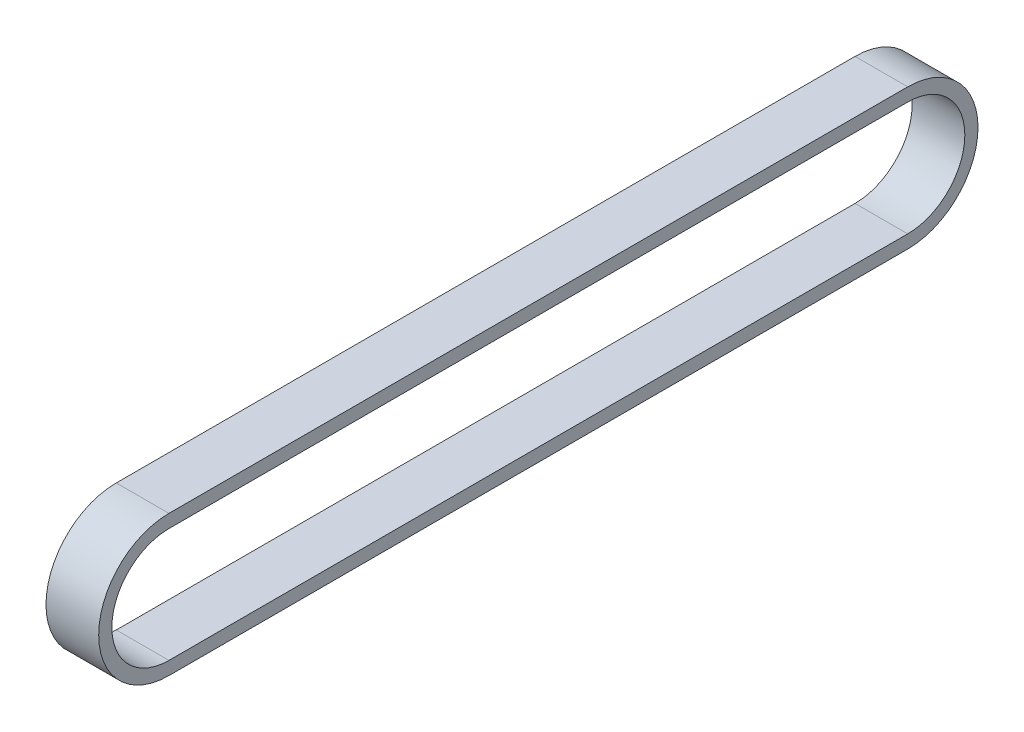
ISO-10303-21;
HEADER;
FILE_DESCRIPTION(('STEP AP214'),'2;1');
FILE_NAME('part.step','',(''),(''),'','','');
FILE_SCHEMA(('AUTOMOTIVE_DESIGN { 1 0 10303 214 1 1 1 1 }'));
ENDSEC;
DATA;
#1=APPLICATION_CONTEXT('core data for automotive mechanical design processes');
#2=APPLICATION_PROTOCOL_DEFINITION('international standard','automotive_design',2000,#1);
#3=PRODUCT_CONTEXT('',#1,'mechanical');
#4=PRODUCT('Part','Part','',(#3));
#5=PRODUCT_RELATED_PRODUCT_CATEGORY('part','',(#4));
#6=PRODUCT_DEFINITION_FORMATION('','',#4);
#7=PRODUCT_DEFINITION_CONTEXT('part definition',#1,'design');
#8=PRODUCT_DEFINITION('design','',#6,#7);
#9=PRODUCT_DEFINITION_SHAPE('','',#8);
#10=(LENGTH_UNIT() NAMED_UNIT(*) SI_UNIT(.MILLI.,.METRE.));
#11=(NAMED_UNIT(*) PLANE_ANGLE_UNIT() SI_UNIT($,.RADIAN.));
#12=(NAMED_UNIT(*) SI_UNIT($,.STERADIAN.) SOLID_ANGLE_UNIT());
#13=UNCERTAINTY_MEASURE_WITH_UNIT(LENGTH_MEASURE(1.E-05),#10,'distance_accuracy_value','');
#14=(GEOMETRIC_REPRESENTATION_CONTEXT(3) GLOBAL_UNCERTAINTY_ASSIGNED_CONTEXT((#13)) GLOBAL_UNIT_ASSIGNED_CONTEXT((#10,
#11,#12)) REPRESENTATION_CONTEXT('',''));
#15=CARTESIAN_POINT('',(0.,0.,0.));
#16=DIRECTION('',(0.,0.,1.));
#17=DIRECTION('',(1.,0.,0.));
#18=AXIS2_PLACEMENT_3D('',#15,#16,#17);
#19=CARTESIAN_POINT('',(0.,0.,0.));
#20=DIRECTION('',(1.,0.,0.));
#21=DIRECTION('',(0.,0.,-1.));
#22=AXIS2_PLACEMENT_3D('',#19,#20,#21);
#23=PLANE('',#22);
#24=DIRECTION('',(0.,0.,1.));
#25=VECTOR('',#24,1.);
#26=CARTESIAN_POINT('',(0.,-20.5975312404905,445.237793437976));
#27=LINE('',#26,#25);
#28=CARTESIAN_POINT('',(0.,-20.5975312404906,795.237793437976));
#29=VERTEX_POINT('',#28);
#30=CARTESIAN_POINT('',(0.,-20.5975312404905,-46.0122065620237));
#31=VERTEX_POINT('',#30);
#32=EDGE_CURVE('E42',#29,#31,#27,.F.);
#33=ORIENTED_EDGE('',*,*,#32,.F.);
#34=CARTESIAN_POINT('',(0.,-85.5975312404904,795.237793437976));
#35=DIRECTION('',(1.,0.,0.));
#36=DIRECTION('',(0.,0.,-1.));
#37=AXIS2_PLACEMENT_3D('',#34,#35,#36);
#38=CIRCLE('',#37,64.9999999999998);
#39=CARTESIAN_POINT('',(0.,-150.59753124049,795.237793437976));
#40=VERTEX_POINT('',#39);
#41=EDGE_CURVE('E141',#40,#29,#38,.F.);
#42=ORIENTED_EDGE('',*,*,#41,.F.);
#43=DIRECTION('',(0.,0.,-1.));
#44=VECTOR('',#43,1.);
#45=CARTESIAN_POINT('',(0.,-150.59753124049,-46.0122065620237));
#46=LINE('',#45,#44);
#47=CARTESIAN_POINT('',(0.,-150.59753124049,-46.0122065620237));
#48=VERTEX_POINT('',#47);
#49=EDGE_CURVE('E115',#48,#40,#46,.F.);
#50=ORIENTED_EDGE('',*,*,#49,.F.);
#51=CARTESIAN_POINT('',(0.,-85.5975312404905,-46.0122065620237));
#52=DIRECTION('',(-1.,0.,0.));
#53=DIRECTION('',(0.,0.,1.));
#54=AXIS2_PLACEMENT_3D('',#51,#52,#53);
#55=CIRCLE('',#54,65.);
#56=EDGE_CURVE('E114',#31,#48,#55,.T.);
#57=ORIENTED_EDGE('',*,*,#56,.F.);
#58=EDGE_LOOP('',(#33,#42,#50,#57));
#59=FACE_BOUND('',#58,.T.);
#60=DIRECTION('',(0.,0.,1.));
#61=VECTOR('',#60,1.);
#62=CARTESIAN_POINT('',(0.,-165.59753124049,-46.0122065620238));
#63=LINE('',#62,#61);
#64=CARTESIAN_POINT('',(0.,-165.59753124049,-46.0122065620238));
#65=VERTEX_POINT('',#64);
#66=CARTESIAN_POINT('',(0.,-165.59753124049,795.237793437976));
#67=VERTEX_POINT('',#66);
#68=EDGE_CURVE('E122',#65,#67,#63,.T.);
#69=ORIENTED_EDGE('',*,*,#68,.T.);
#70=CARTESIAN_POINT('',(0.,-85.5975312404904,795.237793437976));
#71=DIRECTION('',(1.,0.,0.));
#72=DIRECTION('',(0.,0.,-1.));
#73=AXIS2_PLACEMENT_3D('',#70,#71,#72);
#74=CIRCLE('',#73,80.0000000000001);
#75=CARTESIAN_POINT('',(0.,-5.59753124049034,795.237793437976));
#76=VERTEX_POINT('',#75);
#77=EDGE_CURVE('E145',#67,#76,#74,.F.);
#78=ORIENTED_EDGE('',*,*,#77,.T.);
#79=DIRECTION('',(0.,0.,-1.));
#80=VECTOR('',#79,1.);
#81=CARTESIAN_POINT('',(0.,-5.59753124049045,-46.0122065620238));
#82=LINE('',#81,#80);
#83=CARTESIAN_POINT('',(0.,-5.59753124049045,-46.0122065620238));
#84=VERTEX_POINT('',#83);
#85=EDGE_CURVE('E131',#76,#84,#82,.T.);
#86=ORIENTED_EDGE('',*,*,#85,.T.);
#87=CARTESIAN_POINT('',(0.,-85.5975312404905,-46.0122065620237));
#88=DIRECTION('',(-1.,0.,0.));
#89=DIRECTION('',(0.,0.,1.));
#90=AXIS2_PLACEMENT_3D('',#87,#88,#89);
#91=CIRCLE('',#90,80.);
#92=EDGE_CURVE('E119',#84,#65,#91,.T.);
#93=ORIENTED_EDGE('',*,*,#92,.T.);
#94=EDGE_LOOP('',(#69,#78,#86,#93));
#95=FACE_BOUND('',#94,.T.);
#96=ADVANCED_FACE('F39',(#59,#95),#23,.F.);
#97=CARTESIAN_POINT('',(60.,-5.59753124049045,-46.0122065620238));
#98=DIRECTION('',(0.,1.,0.));
#99=DIRECTION('',(0.,0.,1.));
#100=AXIS2_PLACEMENT_3D('',#97,#98,#99);
#101=PLANE('',#100);
#102=ORIENTED_EDGE('',*,*,#85,.F.);
#103=DIRECTION('',(1.,0.,0.));
#104=VECTOR('',#103,1.);
#105=CARTESIAN_POINT('',(-1013.95343211609,-5.59753124049034,795.237793437976));
#106=LINE('',#105,#104);
#107=CARTESIAN_POINT('',(60.,-5.59753124049034,795.237793437976));
#108=VERTEX_POINT('',#107);
#109=EDGE_CURVE('E158',#76,#108,#106,.T.);
#110=ORIENTED_EDGE('',*,*,#109,.T.);
#111=DIRECTION('',(0.,0.,-1.));
#112=VECTOR('',#111,1.);
#113=CARTESIAN_POINT('',(60.,-5.59753124049045,-46.0122065620238));
#114=LINE('',#113,#112);
#115=CARTESIAN_POINT('',(60.,-5.59753124049045,-46.0122065620238));
#116=VERTEX_POINT('',#115);
#117=EDGE_CURVE('E56',#108,#116,#114,.T.);
#118=ORIENTED_EDGE('',*,*,#117,.T.);
#119=DIRECTION('',(-1.,0.,0.));
#120=VECTOR('',#119,1.);
#121=CARTESIAN_POINT('',(60.,-5.59753124049045,-46.0122065620238));
#122=LINE('',#121,#120);
#123=EDGE_CURVE('E11',#116,#84,#122,.T.);
#124=ORIENTED_EDGE('',*,*,#123,.T.);
#125=EDGE_LOOP('',(#102,#110,#118,#124));
#126=FACE_BOUND('',#125,.T.);
#127=ADVANCED_FACE('F179',(#126),#101,.T.);
#128=CARTESIAN_POINT('',(60.,-85.5975312404905,-46.0122065620237));
#129=DIRECTION('',(-1.,0.,0.));
#130=DIRECTION('',(0.,0.,1.));
#131=AXIS2_PLACEMENT_3D('',#128,#129,#130);
#132=CYLINDRICAL_SURFACE('',#131,80.);
#133=ORIENTED_EDGE('',*,*,#92,.F.);
#134=ORIENTED_EDGE('',*,*,#123,.F.);
#135=CARTESIAN_POINT('',(60.,-85.5975312404905,-46.0122065620237));
#136=DIRECTION('',(-1.,0.,0.));
#137=DIRECTION('',(0.,0.,1.));
#138=AXIS2_PLACEMENT_3D('',#135,#136,#137);
#139=CIRCLE('',#138,80.);
#140=CARTESIAN_POINT('',(60.,-165.59753124049,-46.0122065620238));
#141=VERTEX_POINT('',#140);
#142=EDGE_CURVE('E127',#116,#141,#139,.T.);
#143=ORIENTED_EDGE('',*,*,#142,.T.);
#144=DIRECTION('',(-1.,0.,0.));
#145=VECTOR('',#144,1.);
#146=CARTESIAN_POINT('',(60.,-165.59753124049,-46.0122065620238));
#147=LINE('',#146,#145);
#148=EDGE_CURVE('E48',#141,#65,#147,.T.);
#149=ORIENTED_EDGE('',*,*,#148,.T.);
#150=EDGE_LOOP('',(#133,#134,#143,#149));
#151=FACE_BOUND('',#150,.T.);
#152=ADVANCED_FACE('F184',(#151),#132,.T.);
#153=CARTESIAN_POINT('',(60.,-165.59753124049,-46.0122065620238));
#154=DIRECTION('',(0.,-1.,0.));
#155=DIRECTION('',(0.,0.,-1.));
#156=AXIS2_PLACEMENT_3D('',#153,#154,#155);
#157=PLANE('',#156);
#158=ORIENTED_EDGE('',*,*,#68,.F.);
#159=ORIENTED_EDGE('',*,*,#148,.F.);
#160=DIRECTION('',(0.,0.,1.));
#161=VECTOR('',#160,1.);
#162=CARTESIAN_POINT('',(60.,-165.59753124049,-46.0122065620238));
#163=LINE('',#162,#161);
#164=CARTESIAN_POINT('',(60.,-165.59753124049,795.237793437976));
#165=VERTEX_POINT('',#164);
#166=EDGE_CURVE('E130',#141,#165,#163,.T.);
#167=ORIENTED_EDGE('',*,*,#166,.T.);
#168=DIRECTION('',(1.,0.,0.));
#169=VECTOR('',#168,1.);
#170=CARTESIAN_POINT('',(-1013.95343211609,-165.59753124049,795.237793437976));
#171=LINE('',#170,#169);
#172=EDGE_CURVE('E157',#67,#165,#171,.T.);
#173=ORIENTED_EDGE('',*,*,#172,.F.);
#174=EDGE_LOOP('',(#158,#159,#167,#173));
#175=FACE_BOUND('',#174,.T.);
#176=ADVANCED_FACE('F182',(#175),#157,.T.);
#177=CARTESIAN_POINT('',(60.,-85.5975312404905,-46.0122065620237));
#178=DIRECTION('',(-1.,0.,0.));
#179=DIRECTION('',(0.,0.,1.));
#180=AXIS2_PLACEMENT_3D('',#177,#178,#179);
#181=PLANE('',#180);
#182=CARTESIAN_POINT('',(60.,-85.5975312404904,795.237793437976));
#183=DIRECTION('',(1.,0.,0.));
#184=DIRECTION('',(0.,0.,-1.));
#185=AXIS2_PLACEMENT_3D('',#182,#183,#184);
#186=CIRCLE('',#185,80.0000000000001);
#187=EDGE_CURVE('E151',#108,#165,#186,.T.);
#188=ORIENTED_EDGE('',*,*,#187,.T.);
#189=ORIENTED_EDGE('',*,*,#166,.F.);
#190=ORIENTED_EDGE('',*,*,#142,.F.);
#191=ORIENTED_EDGE('',*,*,#117,.F.);
#192=EDGE_LOOP('',(#188,#189,#190,#191));
#193=FACE_BOUND('',#192,.T.);
#194=CARTESIAN_POINT('',(60.,-85.5975312404904,795.237793437976));
#195=DIRECTION('',(1.,0.,0.));
#196=DIRECTION('',(0.,0.,-1.));
#197=AXIS2_PLACEMENT_3D('',#194,#195,#196);
#198=CIRCLE('',#197,64.9999999999998);
#199=CARTESIAN_POINT('',(60.,-20.5975312404906,795.237793437976));
#200=VERTEX_POINT('',#199);
#201=CARTESIAN_POINT('',(60.,-150.59753124049,795.237793437976));
#202=VERTEX_POINT('',#201);
#203=EDGE_CURVE('E148',#200,#202,#198,.T.);
#204=ORIENTED_EDGE('',*,*,#203,.F.);
#205=DIRECTION('',(0.,0.,-1.));
#206=VECTOR('',#205,1.);
#207=CARTESIAN_POINT('',(60.,-20.5975312404905,445.237793437976));
#208=LINE('',#207,#206);
#209=CARTESIAN_POINT('',(60.,-20.5975312404905,-46.0122065620237));
#210=VERTEX_POINT('',#209);
#211=EDGE_CURVE('E107',#200,#210,#208,.T.);
#212=ORIENTED_EDGE('',*,*,#211,.T.);
#213=CARTESIAN_POINT('',(60.,-85.5975312404905,-46.0122065620237));
#214=DIRECTION('',(-1.,0.,0.));
#215=DIRECTION('',(0.,0.,1.));
#216=AXIS2_PLACEMENT_3D('',#213,#214,#215);
#217=CIRCLE('',#216,65.);
#218=CARTESIAN_POINT('',(60.,-150.59753124049,-46.0122065620237));
#219=VERTEX_POINT('',#218);
#220=EDGE_CURVE('E113',#210,#219,#217,.T.);
#221=ORIENTED_EDGE('',*,*,#220,.T.);
#222=DIRECTION('',(0.,0.,1.));
#223=VECTOR('',#222,1.);
#224=CARTESIAN_POINT('',(60.,-150.59753124049,-46.0122065620237));
#225=LINE('',#224,#223);
#226=EDGE_CURVE('E97',#219,#202,#225,.T.);
#227=ORIENTED_EDGE('',*,*,#226,.T.);
#228=EDGE_LOOP('',(#204,#212,#221,#227));
#229=FACE_BOUND('',#228,.T.);
#230=ADVANCED_FACE('F117',(#193,#229),#181,.F.);
#231=CARTESIAN_POINT('',(60.,-85.5975312404905,-46.0122065620237));
#232=DIRECTION('',(-1.,0.,0.));
#233=DIRECTION('',(0.,0.,1.));
#234=AXIS2_PLACEMENT_3D('',#231,#232,#233);
#235=CYLINDRICAL_SURFACE('',#234,65.);
#236=ORIENTED_EDGE('',*,*,#56,.T.);
#237=DIRECTION('',(-1.,0.,0.));
#238=VECTOR('',#237,1.);
#239=CARTESIAN_POINT('',(60.,-150.59753124049,-46.0122065620237));
#240=LINE('',#239,#238);
#241=EDGE_CURVE('E75',#219,#48,#240,.T.);
#242=ORIENTED_EDGE('',*,*,#241,.F.);
#243=ORIENTED_EDGE('',*,*,#220,.F.);
#244=DIRECTION('',(-1.,0.,0.));
#245=VECTOR('',#244,1.);
#246=CARTESIAN_POINT('',(60.,-20.5975312404905,-46.0122065620237));
#247=LINE('',#246,#245);
#248=EDGE_CURVE('E106',#210,#31,#247,.T.);
#249=ORIENTED_EDGE('',*,*,#248,.T.);
#250=EDGE_LOOP('',(#236,#242,#243,#249));
#251=FACE_BOUND('',#250,.T.);
#252=ADVANCED_FACE('F112',(#251),#235,.F.);
#253=CARTESIAN_POINT('',(60.,-150.59753124049,-46.0122065620237));
#254=DIRECTION('',(0.,-1.,0.));
#255=DIRECTION('',(0.,0.,-1.));
#256=AXIS2_PLACEMENT_3D('',#253,#254,#255);
#257=PLANE('',#256);
#258=ORIENTED_EDGE('',*,*,#49,.T.);
#259=DIRECTION('',(1.,0.,0.));
#260=VECTOR('',#259,1.);
#261=CARTESIAN_POINT('',(-1013.95343211609,-150.59753124049,795.237793437976));
#262=LINE('',#261,#260);
#263=EDGE_CURVE('E101',#40,#202,#262,.T.);
#264=ORIENTED_EDGE('',*,*,#263,.T.);
#265=ORIENTED_EDGE('',*,*,#226,.F.);
#266=ORIENTED_EDGE('',*,*,#241,.T.);
#267=EDGE_LOOP('',(#258,#264,#265,#266));
#268=FACE_BOUND('',#267,.T.);
#269=ADVANCED_FACE('F98',(#268),#257,.F.);
#270=CARTESIAN_POINT('',(60.,-20.5975312404905,445.237793437976));
#271=DIRECTION('',(0.,1.,0.));
#272=DIRECTION('',(0.,0.,1.));
#273=AXIS2_PLACEMENT_3D('',#270,#271,#272);
#274=PLANE('',#273);
#275=ORIENTED_EDGE('',*,*,#248,.F.);
#276=ORIENTED_EDGE('',*,*,#211,.F.);
#277=DIRECTION('',(1.,0.,0.));
#278=VECTOR('',#277,1.);
#279=CARTESIAN_POINT('',(-1013.95343211609,-20.5975312404906,795.237793437976));
#280=LINE('',#279,#278);
#281=EDGE_CURVE('E149',#29,#200,#280,.T.);
#282=ORIENTED_EDGE('',*,*,#281,.F.);
#283=ORIENTED_EDGE('',*,*,#32,.T.);
#284=EDGE_LOOP('',(#275,#276,#282,#283));
#285=FACE_BOUND('',#284,.T.);
#286=ADVANCED_FACE('F223',(#285),#274,.F.);
#287=CARTESIAN_POINT('',(-1013.95343211609,-85.5975312404904,795.237793437976));
#288=DIRECTION('',(1.,0.,0.));
#289=DIRECTION('',(0.,0.,-1.));
#290=AXIS2_PLACEMENT_3D('',#287,#288,#289);
#291=CYLINDRICAL_SURFACE('',#290,80.0000000000001);
#292=ORIENTED_EDGE('',*,*,#77,.F.);
#293=ORIENTED_EDGE('',*,*,#172,.T.);
#294=ORIENTED_EDGE('',*,*,#187,.F.);
#295=ORIENTED_EDGE('',*,*,#109,.F.);
#296=EDGE_LOOP('',(#292,#293,#294,#295));
#297=FACE_BOUND('',#296,.T.);
#298=ADVANCED_FACE('F167',(#297),#291,.T.);
#299=CARTESIAN_POINT('',(-1013.95343211609,-85.5975312404904,795.237793437976));
#300=DIRECTION('',(1.,0.,0.));
#301=DIRECTION('',(0.,0.,-1.));
#302=AXIS2_PLACEMENT_3D('',#299,#300,#301);
#303=CYLINDRICAL_SURFACE('',#302,64.9999999999998);
#304=ORIENTED_EDGE('',*,*,#263,.F.);
#305=ORIENTED_EDGE('',*,*,#41,.T.);
#306=ORIENTED_EDGE('',*,*,#281,.T.);
#307=ORIENTED_EDGE('',*,*,#203,.T.);
#308=EDGE_LOOP('',(#304,#305,#306,#307));
#309=FACE_BOUND('',#308,.T.);
#310=ADVANCED_FACE('F147',(#309),#303,.F.);
#311=CLOSED_SHELL('',(#96,#127,#152,#176,#230,#252,#269,#286,#298,#310));
#312=MANIFOLD_SOLID_BREP('B2',#311);
#313=ADVANCED_BREP_SHAPE_REPRESENTATION('',(#18,#312),#14);
#314=SHAPE_DEFINITION_REPRESENTATION(#9,#313);
ENDSEC;
END-ISO-10303-21;
